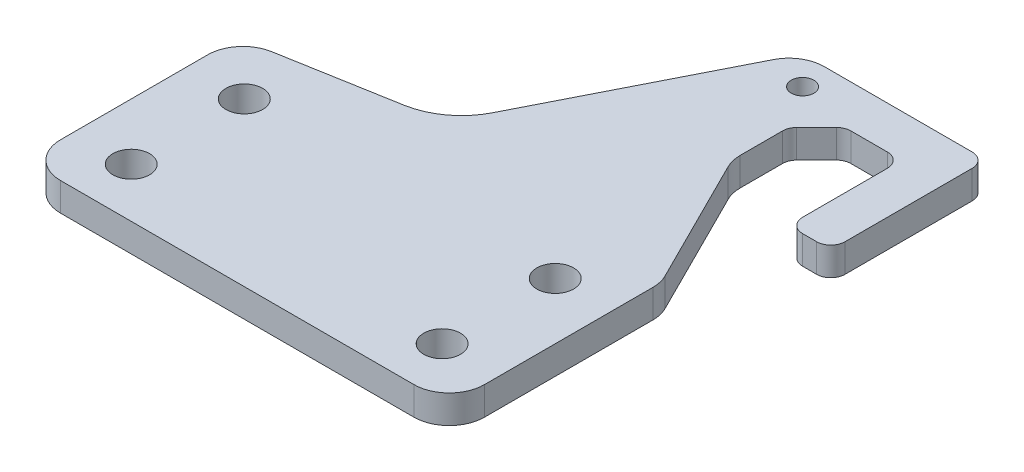
ISO-10303-21;
HEADER;
FILE_DESCRIPTION(('STEP AP214'),'2;1');
FILE_NAME('part.step','',(''),(''),'','','');
FILE_SCHEMA(('AUTOMOTIVE_DESIGN { 1 0 10303 214 1 1 1 1 }'));
ENDSEC;
DATA;
#1=APPLICATION_CONTEXT('core data for automotive mechanical design processes');
#2=APPLICATION_PROTOCOL_DEFINITION('international standard','automotive_design',2000,#1);
#3=PRODUCT_CONTEXT('',#1,'mechanical');
#4=PRODUCT('Part','Part','',(#3));
#5=PRODUCT_RELATED_PRODUCT_CATEGORY('part','',(#4));
#6=PRODUCT_DEFINITION_FORMATION('','',#4);
#7=PRODUCT_DEFINITION_CONTEXT('part definition',#1,'design');
#8=PRODUCT_DEFINITION('design','',#6,#7);
#9=PRODUCT_DEFINITION_SHAPE('','',#8);
#10=(LENGTH_UNIT() NAMED_UNIT(*) SI_UNIT(.MILLI.,.METRE.));
#11=(NAMED_UNIT(*) PLANE_ANGLE_UNIT() SI_UNIT($,.RADIAN.));
#12=(NAMED_UNIT(*) SI_UNIT($,.STERADIAN.) SOLID_ANGLE_UNIT());
#13=UNCERTAINTY_MEASURE_WITH_UNIT(LENGTH_MEASURE(1.E-05),#10,'distance_accuracy_value','');
#14=(GEOMETRIC_REPRESENTATION_CONTEXT(3) GLOBAL_UNCERTAINTY_ASSIGNED_CONTEXT((#13)) GLOBAL_UNIT_ASSIGNED_CONTEXT((#10,
#11,#12)) REPRESENTATION_CONTEXT('',''));
#15=CARTESIAN_POINT('',(0.,0.,0.));
#16=DIRECTION('',(0.,0.,1.));
#17=DIRECTION('',(1.,0.,0.));
#18=AXIS2_PLACEMENT_3D('',#15,#16,#17);
#19=CARTESIAN_POINT('',(30.,4.,-15.));
#20=DIRECTION('',(-0.894427190999916,0.,0.447213595499958));
#21=DIRECTION('',(0.447213595499958,0.,0.894427190999916));
#22=AXIS2_PLACEMENT_3D('',#19,#20,#21);
#23=PLANE('',#22);
#24=DIRECTION('',(-0.447213595499958,0.,-0.894427190999916));
#25=VECTOR('',#24,1.);
#26=CARTESIAN_POINT('',(30.,0.,-15.));
#27=LINE('',#26,#25);
#28=CARTESIAN_POINT('',(29.4721359549996,0.,-16.0557280900008));
#29=VERTEX_POINT('',#28);
#30=CARTESIAN_POINT('',(20.5278640450004,0.,-33.9442719099992));
#31=VERTEX_POINT('',#30);
#32=EDGE_CURVE('E428',#29,#31,#27,.T.);
#33=ORIENTED_EDGE('',*,*,#32,.T.);
#34=DIRECTION('',(0.,-1.,0.));
#35=VECTOR('',#34,1.);
#36=CARTESIAN_POINT('',(20.5278640450004,4.,-33.9442719099992));
#37=LINE('',#36,#35);
#38=CARTESIAN_POINT('',(20.5278640450004,4.,-33.9442719099992));
#39=VERTEX_POINT('',#38);
#40=EDGE_CURVE('E289',#31,#39,#37,.F.);
#41=ORIENTED_EDGE('',*,*,#40,.T.);
#42=DIRECTION('',(-0.447213595499958,0.,-0.894427190999916));
#43=VECTOR('',#42,1.);
#44=CARTESIAN_POINT('',(30.,4.,-15.));
#45=LINE('',#44,#43);
#46=CARTESIAN_POINT('',(29.4721359549996,4.,-16.0557280900008));
#47=VERTEX_POINT('',#46);
#48=EDGE_CURVE('E253',#47,#39,#45,.T.);
#49=ORIENTED_EDGE('',*,*,#48,.F.);
#50=DIRECTION('',(0.,-1.,0.));
#51=VECTOR('',#50,1.);
#52=CARTESIAN_POINT('',(29.4721359549996,4.,-16.0557280900008));
#53=LINE('',#52,#51);
#54=EDGE_CURVE('E286',#47,#29,#53,.T.);
#55=ORIENTED_EDGE('',*,*,#54,.T.);
#56=EDGE_LOOP('',(#33,#41,#49,#55));
#57=FACE_BOUND('',#56,.T.);
#58=ADVANCED_FACE('F39',(#57),#23,.F.);
#59=CARTESIAN_POINT('',(20.,4.,-35.));
#60=DIRECTION('',(-1.,0.,0.));
#61=DIRECTION('',(0.,0.,1.));
#62=AXIS2_PLACEMENT_3D('',#59,#60,#61);
#63=PLANE('',#62);
#64=DIRECTION('',(0.,0.,-1.));
#65=VECTOR('',#64,1.);
#66=CARTESIAN_POINT('',(20.,0.,-35.));
#67=LINE('',#66,#65);
#68=CARTESIAN_POINT('',(20.,0.,-36.180339887499));
#69=VERTEX_POINT('',#68);
#70=CARTESIAN_POINT('',(20.,0.,-42.1715728752538));
#71=VERTEX_POINT('',#70);
#72=EDGE_CURVE('E454',#69,#71,#67,.T.);
#73=ORIENTED_EDGE('',*,*,#72,.T.);
#74=DIRECTION('',(0.,-1.,0.));
#75=VECTOR('',#74,1.);
#76=CARTESIAN_POINT('',(20.,4.,-42.1715728752538));
#77=LINE('',#76,#75);
#78=CARTESIAN_POINT('',(20.,4.,-42.1715728752538));
#79=VERTEX_POINT('',#78);
#80=EDGE_CURVE('E317',#71,#79,#77,.F.);
#81=ORIENTED_EDGE('',*,*,#80,.T.);
#82=DIRECTION('',(0.,0.,-1.));
#83=VECTOR('',#82,1.);
#84=CARTESIAN_POINT('',(20.,4.,-35.));
#85=LINE('',#84,#83);
#86=CARTESIAN_POINT('',(20.,4.,-36.180339887499));
#87=VERTEX_POINT('',#86);
#88=EDGE_CURVE('E433',#87,#79,#85,.T.);
#89=ORIENTED_EDGE('',*,*,#88,.F.);
#90=DIRECTION('',(0.,-1.,0.));
#91=VECTOR('',#90,1.);
#92=CARTESIAN_POINT('',(20.,0.,-36.180339887499));
#93=LINE('',#92,#91);
#94=EDGE_CURVE('E283',#87,#69,#93,.T.);
#95=ORIENTED_EDGE('',*,*,#94,.T.);
#96=EDGE_LOOP('',(#73,#81,#89,#95));
#97=FACE_BOUND('',#96,.T.);
#98=ADVANCED_FACE('F512',(#97),#63,.F.);
#99=CARTESIAN_POINT('',(20.,4.,-43.));
#100=DIRECTION('',(-0.707106781186546,0.,-0.707106781186549));
#101=DIRECTION('',(-0.707106781186549,0.,0.707106781186546));
#102=AXIS2_PLACEMENT_3D('',#99,#100,#101);
#103=PLANE('',#102);
#104=DIRECTION('',(0.707106781186549,0.,-0.707106781186546));
#105=VECTOR('',#104,1.);
#106=CARTESIAN_POINT('',(20.,4.,-43.));
#107=LINE('',#106,#105);
#108=CARTESIAN_POINT('',(20.5857864376269,4.,-43.5857864376269));
#109=VERTEX_POINT('',#108);
#110=CARTESIAN_POINT('',(23.4142135623731,4.,-46.4142135623731));
#111=VERTEX_POINT('',#110);
#112=EDGE_CURVE('E436',#109,#111,#107,.T.);
#113=ORIENTED_EDGE('',*,*,#112,.F.);
#114=DIRECTION('',(0.,-1.,0.));
#115=VECTOR('',#114,1.);
#116=CARTESIAN_POINT('',(20.5857864376269,0.,-43.5857864376269));
#117=LINE('',#116,#115);
#118=CARTESIAN_POINT('',(20.5857864376269,0.,-43.5857864376269));
#119=VERTEX_POINT('',#118);
#120=EDGE_CURVE('E314',#109,#119,#117,.T.);
#121=ORIENTED_EDGE('',*,*,#120,.T.);
#122=DIRECTION('',(0.707106781186549,0.,-0.707106781186546));
#123=VECTOR('',#122,1.);
#124=CARTESIAN_POINT('',(20.,0.,-43.));
#125=LINE('',#124,#123);
#126=CARTESIAN_POINT('',(23.4142135623731,0.,-46.4142135623731));
#127=VERTEX_POINT('',#126);
#128=EDGE_CURVE('E457',#119,#127,#125,.T.);
#129=ORIENTED_EDGE('',*,*,#128,.T.);
#130=DIRECTION('',(0.,-1.,0.));
#131=VECTOR('',#130,1.);
#132=CARTESIAN_POINT('',(23.4142135623731,4.,-46.4142135623731));
#133=LINE('',#132,#131);
#134=EDGE_CURVE('E312',#127,#111,#133,.F.);
#135=ORIENTED_EDGE('',*,*,#134,.T.);
#136=EDGE_LOOP('',(#113,#121,#129,#135));
#137=FACE_BOUND('',#136,.T.);
#138=ADVANCED_FACE('F521',(#137),#103,.F.);
#139=CARTESIAN_POINT('',(24.,4.,-53.));
#140=DIRECTION('',(0.,0.,1.));
#141=DIRECTION('',(1.,0.,0.));
#142=AXIS2_PLACEMENT_3D('',#139,#140,#141);
#143=PLANE('',#142);
#144=DIRECTION('',(-1.,0.,0.));
#145=VECTOR('',#144,1.);
#146=CARTESIAN_POINT('',(24.,4.,-53.));
#147=LINE('',#146,#145);
#148=CARTESIAN_POINT('',(36.,4.,-53.));
#149=VERTEX_POINT('',#148);
#150=CARTESIAN_POINT('',(15.0734435338877,4.,-53.));
#151=VERTEX_POINT('',#150);
#152=EDGE_CURVE('E439',#149,#151,#147,.T.);
#153=ORIENTED_EDGE('',*,*,#152,.F.);
#154=DIRECTION('',(0.,1.,0.));
#155=VECTOR('',#154,1.);
#156=CARTESIAN_POINT('',(36.,0.,-53.));
#157=LINE('',#156,#155);
#158=CARTESIAN_POINT('',(36.,0.,-53.));
#159=VERTEX_POINT('',#158);
#160=EDGE_CURVE('E350',#149,#159,#157,.F.);
#161=ORIENTED_EDGE('',*,*,#160,.T.);
#162=DIRECTION('',(-1.,0.,0.));
#163=VECTOR('',#162,1.);
#164=CARTESIAN_POINT('',(24.,0.,-53.));
#165=LINE('',#164,#163);
#166=CARTESIAN_POINT('',(15.0734435338877,0.,-53.));
#167=VERTEX_POINT('',#166);
#168=EDGE_CURVE('E245',#159,#167,#165,.T.);
#169=ORIENTED_EDGE('',*,*,#168,.T.);
#170=DIRECTION('',(0.,-1.,0.));
#171=VECTOR('',#170,1.);
#172=CARTESIAN_POINT('',(15.0734435338877,4.,-53.));
#173=LINE('',#172,#171);
#174=EDGE_CURVE('E270',#167,#151,#173,.F.);
#175=ORIENTED_EDGE('',*,*,#174,.T.);
#176=EDGE_LOOP('',(#153,#161,#169,#175));
#177=FACE_BOUND('',#176,.T.);
#178=ADVANCED_FACE('F461',(#177),#143,.F.);
#179=CARTESIAN_POINT('',(12.,4.,-53.));
#180=DIRECTION('',(0.89224833437936,0.,0.451545025215934));
#181=DIRECTION('',(0.451545025215934,0.,-0.89224833437936));
#182=AXIS2_PLACEMENT_3D('',#179,#180,#181);
#183=PLANE('',#182);
#184=DIRECTION('',(-0.451545025215934,0.,0.89224833437936));
#185=VECTOR('',#184,1.);
#186=CARTESIAN_POINT('',(12.,4.,-53.));
#187=LINE('',#186,#185);
#188=CARTESIAN_POINT('',(10.6122018619909,4.,-50.2577251260797));
#189=VERTEX_POINT('',#188);
#190=CARTESIAN_POINT('',(-2.74094267925489,4.,-23.8720485925915));
#191=VERTEX_POINT('',#190);
#192=EDGE_CURVE('E441',#189,#191,#187,.T.);
#193=ORIENTED_EDGE('',*,*,#192,.F.);
#194=DIRECTION('',(0.,-1.,0.));
#195=VECTOR('',#194,1.);
#196=CARTESIAN_POINT('',(10.6122018619909,4.,-50.2577251260797));
#197=LINE('',#196,#195);
#198=CARTESIAN_POINT('',(10.6122018619909,0.,-50.2577251260797));
#199=VERTEX_POINT('',#198);
#200=EDGE_CURVE('E257',#189,#199,#197,.T.);
#201=ORIENTED_EDGE('',*,*,#200,.T.);
#202=DIRECTION('',(-0.451545025215934,0.,0.89224833437936));
#203=VECTOR('',#202,1.);
#204=CARTESIAN_POINT('',(12.,0.,-53.));
#205=LINE('',#204,#203);
#206=CARTESIAN_POINT('',(-2.74094267925489,0.,-23.8720485925915));
#207=VERTEX_POINT('',#206);
#208=EDGE_CURVE('E240',#199,#207,#205,.T.);
#209=ORIENTED_EDGE('',*,*,#208,.T.);
#210=DIRECTION('',(0.,-1.,0.));
#211=VECTOR('',#210,1.);
#212=CARTESIAN_POINT('',(-2.74094267925489,4.,-23.8720485925915));
#213=LINE('',#212,#211);
#214=EDGE_CURVE('E220',#207,#191,#213,.F.);
#215=ORIENTED_EDGE('',*,*,#214,.T.);
#216=EDGE_LOOP('',(#193,#201,#209,#215));
#217=FACE_BOUND('',#216,.T.);
#218=ADVANCED_FACE('F470',(#217),#183,.F.);
#219=CARTESIAN_POINT('',(-5.,4.,-19.4081745177117));
#220=DIRECTION('',(0.173648177666934,0.,0.984807753012207));
#221=DIRECTION('',(0.984807753012208,0.,-0.173648177666934));
#222=AXIS2_PLACEMENT_3D('',#219,#220,#221);
#223=PLANE('',#222);
#224=DIRECTION('',(-0.984807753012207,0.,0.173648177666934));
#225=VECTOR('',#224,1.);
#226=CARTESIAN_POINT('',(-5.,0.,-19.4081745177117));
#227=LINE('',#226,#225);
#228=CARTESIAN_POINT('',(-9.92694424637915,0.,-18.5394213146287));
#229=VERTEX_POINT('',#228);
#230=CARTESIAN_POINT('',(-25.8682408883347,0.,-15.7285406091747));
#231=VERTEX_POINT('',#230);
#232=EDGE_CURVE('E229',#229,#231,#227,.T.);
#233=ORIENTED_EDGE('',*,*,#232,.T.);
#234=DIRECTION('',(0.,-1.,0.));
#235=VECTOR('',#234,1.);
#236=CARTESIAN_POINT('',(-25.8682408883347,4.,-15.7285406091747));
#237=LINE('',#236,#235);
#238=CARTESIAN_POINT('',(-25.8682408883347,4.,-15.7285406091747));
#239=VERTEX_POINT('',#238);
#240=EDGE_CURVE('E306',#231,#239,#237,.F.);
#241=ORIENTED_EDGE('',*,*,#240,.T.);
#242=DIRECTION('',(-0.984807753012207,0.,0.173648177666934));
#243=VECTOR('',#242,1.);
#244=CARTESIAN_POINT('',(-5.,4.,-19.4081745177117));
#245=LINE('',#244,#243);
#246=CARTESIAN_POINT('',(-9.92694424637915,4.,-18.5394213146287));
#247=VERTEX_POINT('',#246);
#248=EDGE_CURVE('E232',#247,#239,#245,.T.);
#249=ORIENTED_EDGE('',*,*,#248,.F.);
#250=DIRECTION('',(0.,-1.,0.));
#251=VECTOR('',#250,1.);
#252=CARTESIAN_POINT('',(-9.92694424637915,0.,-18.5394213146287));
#253=LINE('',#252,#251);
#254=EDGE_CURVE('E218',#247,#229,#253,.T.);
#255=ORIENTED_EDGE('',*,*,#254,.T.);
#256=EDGE_LOOP('',(#233,#241,#249,#255));
#257=FACE_BOUND('',#256,.T.);
#258=ADVANCED_FACE('F228',(#257),#223,.F.);
#259=CARTESIAN_POINT('',(-30.,4.,15.));
#260=DIRECTION('',(1.,0.,0.));
#261=DIRECTION('',(0.,0.,-1.));
#262=AXIS2_PLACEMENT_3D('',#259,#260,#261);
#263=PLANE('',#262);
#264=DIRECTION('',(0.,0.,1.));
#265=VECTOR('',#264,1.);
#266=CARTESIAN_POINT('',(-30.,0.,15.));
#267=LINE('',#266,#265);
#268=CARTESIAN_POINT('',(-30.,0.,-10.8045018441136));
#269=VERTEX_POINT('',#268);
#270=CARTESIAN_POINT('',(-30.,0.,10.));
#271=VERTEX_POINT('',#270);
#272=EDGE_CURVE('E239',#269,#271,#267,.T.);
#273=ORIENTED_EDGE('',*,*,#272,.T.);
#274=DIRECTION('',(0.,-1.,0.));
#275=VECTOR('',#274,1.);
#276=CARTESIAN_POINT('',(-30.,4.,10.));
#277=LINE('',#276,#275);
#278=CARTESIAN_POINT('',(-30.,4.,10.));
#279=VERTEX_POINT('',#278);
#280=EDGE_CURVE('E304',#271,#279,#277,.F.);
#281=ORIENTED_EDGE('',*,*,#280,.T.);
#282=DIRECTION('',(0.,0.,1.));
#283=VECTOR('',#282,1.);
#284=CARTESIAN_POINT('',(-30.,4.,15.));
#285=LINE('',#284,#283);
#286=CARTESIAN_POINT('',(-30.,4.,-10.8045018441136));
#287=VERTEX_POINT('',#286);
#288=EDGE_CURVE('E444',#287,#279,#285,.T.);
#289=ORIENTED_EDGE('',*,*,#288,.F.);
#290=DIRECTION('',(0.,-1.,0.));
#291=VECTOR('',#290,1.);
#292=CARTESIAN_POINT('',(-30.,4.,-10.8045018441136));
#293=LINE('',#292,#291);
#294=EDGE_CURVE('E301',#287,#269,#293,.T.);
#295=ORIENTED_EDGE('',*,*,#294,.T.);
#296=EDGE_LOOP('',(#273,#281,#289,#295));
#297=FACE_BOUND('',#296,.T.);
#298=ADVANCED_FACE('F477',(#297),#263,.F.);
#299=CARTESIAN_POINT('',(-30.,4.,15.));
#300=DIRECTION('',(0.,0.,-1.));
#301=DIRECTION('',(-1.,0.,0.));
#302=AXIS2_PLACEMENT_3D('',#299,#300,#301);
#303=PLANE('',#302);
#304=DIRECTION('',(1.,0.,0.));
#305=VECTOR('',#304,1.);
#306=CARTESIAN_POINT('',(-30.,0.,15.));
#307=LINE('',#306,#305);
#308=CARTESIAN_POINT('',(-25.,0.,15.));
#309=VERTEX_POINT('',#308);
#310=CARTESIAN_POINT('',(25.,0.,15.));
#311=VERTEX_POINT('',#310);
#312=EDGE_CURVE('E243',#309,#311,#307,.T.);
#313=ORIENTED_EDGE('',*,*,#312,.T.);
#314=DIRECTION('',(0.,-1.,0.));
#315=VECTOR('',#314,1.);
#316=CARTESIAN_POINT('',(25.,4.,15.));
#317=LINE('',#316,#315);
#318=CARTESIAN_POINT('',(25.,4.,15.));
#319=VERTEX_POINT('',#318);
#320=EDGE_CURVE('E299',#311,#319,#317,.F.);
#321=ORIENTED_EDGE('',*,*,#320,.T.);
#322=DIRECTION('',(1.,0.,0.));
#323=VECTOR('',#322,1.);
#324=CARTESIAN_POINT('',(-30.,4.,15.));
#325=LINE('',#324,#323);
#326=CARTESIAN_POINT('',(-25.,4.,15.));
#327=VERTEX_POINT('',#326);
#328=EDGE_CURVE('E447',#327,#319,#325,.T.);
#329=ORIENTED_EDGE('',*,*,#328,.F.);
#330=DIRECTION('',(0.,-1.,0.));
#331=VECTOR('',#330,1.);
#332=CARTESIAN_POINT('',(-25.,4.,15.));
#333=LINE('',#332,#331);
#334=EDGE_CURVE('E296',#327,#309,#333,.T.);
#335=ORIENTED_EDGE('',*,*,#334,.T.);
#336=EDGE_LOOP('',(#313,#321,#329,#335));
#337=FACE_BOUND('',#336,.T.);
#338=ADVANCED_FACE('F486',(#337),#303,.F.);
#339=CARTESIAN_POINT('',(30.,4.,15.));
#340=DIRECTION('',(-1.,0.,0.));
#341=DIRECTION('',(0.,0.,1.));
#342=AXIS2_PLACEMENT_3D('',#339,#340,#341);
#343=PLANE('',#342);
#344=DIRECTION('',(0.,0.,-1.));
#345=VECTOR('',#344,1.);
#346=CARTESIAN_POINT('',(30.,0.,15.));
#347=LINE('',#346,#345);
#348=CARTESIAN_POINT('',(30.,0.,10.));
#349=VERTEX_POINT('',#348);
#350=CARTESIAN_POINT('',(30.,0.,-13.819660112501));
#351=VERTEX_POINT('',#350);
#352=EDGE_CURVE('E251',#349,#351,#347,.T.);
#353=ORIENTED_EDGE('',*,*,#352,.T.);
#354=DIRECTION('',(0.,-1.,0.));
#355=VECTOR('',#354,1.);
#356=CARTESIAN_POINT('',(30.,4.,-13.819660112501));
#357=LINE('',#356,#355);
#358=CARTESIAN_POINT('',(30.,4.,-13.819660112501));
#359=VERTEX_POINT('',#358);
#360=EDGE_CURVE('E294',#351,#359,#357,.F.);
#361=ORIENTED_EDGE('',*,*,#360,.T.);
#362=DIRECTION('',(0.,0.,-1.));
#363=VECTOR('',#362,1.);
#364=CARTESIAN_POINT('',(30.,4.,15.));
#365=LINE('',#364,#363);
#366=CARTESIAN_POINT('',(30.,4.,10.));
#367=VERTEX_POINT('',#366);
#368=EDGE_CURVE('E233',#367,#359,#365,.T.);
#369=ORIENTED_EDGE('',*,*,#368,.F.);
#370=DIRECTION('',(0.,-1.,0.));
#371=VECTOR('',#370,1.);
#372=CARTESIAN_POINT('',(30.,4.,10.));
#373=LINE('',#372,#371);
#374=EDGE_CURVE('E291',#367,#349,#373,.T.);
#375=ORIENTED_EDGE('',*,*,#374,.T.);
#376=EDGE_LOOP('',(#353,#361,#369,#375));
#377=FACE_BOUND('',#376,.T.);
#378=ADVANCED_FACE('F495',(#377),#343,.F.);
#379=CARTESIAN_POINT('',(0.,4.,0.));
#380=DIRECTION('',(0.,1.,0.));
#381=DIRECTION('',(0.,0.,1.));
#382=AXIS2_PLACEMENT_3D('',#379,#380,#381);
#383=PLANE('',#382);
#384=CARTESIAN_POINT('',(16.,4.,-49.));
#385=DIRECTION('',(0.,-1.,0.));
#386=DIRECTION('',(0.,0.,-1.));
#387=AXIS2_PLACEMENT_3D('',#384,#385,#386);
#388=CIRCLE('',#387,1.6);
#389=CARTESIAN_POINT('',(16.,4.,-50.6));
#390=VERTEX_POINT('',#389);
#391=EDGE_CURVE('E401',#390,#390,#388,.T.);
#392=ORIENTED_EDGE('',*,*,#391,.T.);
#393=EDGE_LOOP('',(#392));
#394=FACE_BOUND('',#393,.T.);
#395=CARTESIAN_POINT('',(-22.,4.,8.00000000000001));
#396=DIRECTION('',(0.,1.,0.));
#397=DIRECTION('',(0.,0.,-1.));
#398=AXIS2_PLACEMENT_3D('',#395,#396,#397);
#399=CIRCLE('',#398,2.6);
#400=CARTESIAN_POINT('',(-22.,4.,5.40000000000001));
#401=VERTEX_POINT('',#400);
#402=EDGE_CURVE('E404',#401,#401,#399,.T.);
#403=ORIENTED_EDGE('',*,*,#402,.F.);
#404=EDGE_LOOP('',(#403));
#405=FACE_BOUND('',#404,.T.);
#406=CARTESIAN_POINT('',(22.,4.,7.99999999999999));
#407=DIRECTION('',(0.,1.,0.));
#408=DIRECTION('',(0.,0.,1.));
#409=AXIS2_PLACEMENT_3D('',#406,#407,#408);
#410=CIRCLE('',#409,2.6);
#411=CARTESIAN_POINT('',(22.,4.,10.6));
#412=VERTEX_POINT('',#411);
#413=EDGE_CURVE('E417',#412,#412,#410,.T.);
#414=ORIENTED_EDGE('',*,*,#413,.F.);
#415=EDGE_LOOP('',(#414));
#416=FACE_BOUND('',#415,.T.);
#417=CARTESIAN_POINT('',(22.,4.,-8.));
#418=DIRECTION('',(0.,1.,0.));
#419=DIRECTION('',(0.,0.,-1.));
#420=AXIS2_PLACEMENT_3D('',#417,#418,#419);
#421=CIRCLE('',#420,2.6);
#422=CARTESIAN_POINT('',(22.,4.,-10.6));
#423=VERTEX_POINT('',#422);
#424=EDGE_CURVE('E411',#423,#423,#421,.T.);
#425=ORIENTED_EDGE('',*,*,#424,.F.);
#426=EDGE_LOOP('',(#425));
#427=FACE_BOUND('',#426,.T.);
#428=CARTESIAN_POINT('',(-22.,4.,-8.));
#429=DIRECTION('',(0.,1.,0.));
#430=DIRECTION('',(0.,0.,1.));
#431=AXIS2_PLACEMENT_3D('',#428,#429,#430);
#432=CIRCLE('',#431,2.6);
#433=CARTESIAN_POINT('',(-22.,4.,-5.4));
#434=VERTEX_POINT('',#433);
#435=EDGE_CURVE('E410',#434,#434,#432,.T.);
#436=ORIENTED_EDGE('',*,*,#435,.F.);
#437=EDGE_LOOP('',(#436));
#438=FACE_BOUND('',#437,.T.);
#439=DIRECTION('',(0.,0.,1.));
#440=VECTOR('',#439,1.);
#441=CARTESIAN_POINT('',(32.,4.,-47.));
#442=LINE('',#441,#440);
#443=CARTESIAN_POINT('',(32.,4.,-45.));
#444=VERTEX_POINT('',#443);
#445=CARTESIAN_POINT('',(32.,4.,-33.));
#446=VERTEX_POINT('',#445);
#447=EDGE_CURVE('E364',#444,#446,#442,.T.);
#448=ORIENTED_EDGE('',*,*,#447,.T.);
#449=CARTESIAN_POINT('',(34.,4.,-33.));
#450=DIRECTION('',(0.,1.,0.));
#451=DIRECTION('',(0.,0.,1.));
#452=AXIS2_PLACEMENT_3D('',#449,#450,#451);
#453=CIRCLE('',#452,2.);
#454=CARTESIAN_POINT('',(34.,4.,-31.));
#455=VERTEX_POINT('',#454);
#456=EDGE_CURVE('E334',#446,#455,#453,.T.);
#457=ORIENTED_EDGE('',*,*,#456,.T.);
#458=DIRECTION('',(1.,0.,0.));
#459=VECTOR('',#458,1.);
#460=CARTESIAN_POINT('',(32.,4.,-31.));
#461=LINE('',#460,#459);
#462=CARTESIAN_POINT('',(36.,4.,-31.));
#463=VERTEX_POINT('',#462);
#464=EDGE_CURVE('E375',#455,#463,#461,.T.);
#465=ORIENTED_EDGE('',*,*,#464,.T.);
#466=CARTESIAN_POINT('',(36.,4.,-33.));
#467=DIRECTION('',(0.,1.,0.));
#468=DIRECTION('',(0.,0.,1.));
#469=AXIS2_PLACEMENT_3D('',#466,#467,#468);
#470=CIRCLE('',#469,2.);
#471=CARTESIAN_POINT('',(38.,4.,-33.));
#472=VERTEX_POINT('',#471);
#473=EDGE_CURVE('E330',#463,#472,#470,.T.);
#474=ORIENTED_EDGE('',*,*,#473,.T.);
#475=DIRECTION('',(0.,0.,-1.));
#476=VECTOR('',#475,1.);
#477=CARTESIAN_POINT('',(38.,4.,-31.));
#478=LINE('',#477,#476);
#479=CARTESIAN_POINT('',(38.,4.,-51.));
#480=VERTEX_POINT('',#479);
#481=EDGE_CURVE('E386',#472,#480,#478,.T.);
#482=ORIENTED_EDGE('',*,*,#481,.T.);
#483=CARTESIAN_POINT('',(36.,4.,-51.));
#484=DIRECTION('',(0.,1.,0.));
#485=DIRECTION('',(0.,0.,1.));
#486=AXIS2_PLACEMENT_3D('',#483,#484,#485);
#487=CIRCLE('',#486,2.);
#488=EDGE_CURVE('E332',#480,#149,#487,.T.);
#489=ORIENTED_EDGE('',*,*,#488,.T.);
#490=ORIENTED_EDGE('',*,*,#152,.T.);
#491=CARTESIAN_POINT('',(15.0734435338877,4.,-48.));
#492=DIRECTION('',(0.,1.,0.));
#493=DIRECTION('',(0.,0.,1.));
#494=AXIS2_PLACEMENT_3D('',#491,#492,#493);
#495=CIRCLE('',#494,5.);
#496=EDGE_CURVE('E281',#151,#189,#495,.T.);
#497=ORIENTED_EDGE('',*,*,#496,.T.);
#498=ORIENTED_EDGE('',*,*,#192,.T.);
#499=CARTESIAN_POINT('',(-11.6634260230485,4.,-28.3874988447508));
#500=DIRECTION('',(0.,1.,0.));
#501=DIRECTION('',(0.,0.,1.));
#502=AXIS2_PLACEMENT_3D('',#499,#500,#501);
#503=CIRCLE('',#502,10.);
#504=EDGE_CURVE('E223',#191,#247,#503,.F.);
#505=ORIENTED_EDGE('',*,*,#504,.T.);
#506=ORIENTED_EDGE('',*,*,#248,.T.);
#507=CARTESIAN_POINT('',(-25.,4.,-10.8045018441136));
#508=DIRECTION('',(0.,1.,0.));
#509=DIRECTION('',(0.,0.,1.));
#510=AXIS2_PLACEMENT_3D('',#507,#508,#509);
#511=CIRCLE('',#510,5.);
#512=EDGE_CURVE('E273',#239,#287,#511,.T.);
#513=ORIENTED_EDGE('',*,*,#512,.T.);
#514=ORIENTED_EDGE('',*,*,#288,.T.);
#515=CARTESIAN_POINT('',(-25.,4.,10.));
#516=DIRECTION('',(0.,1.,0.));
#517=DIRECTION('',(0.,0.,1.));
#518=AXIS2_PLACEMENT_3D('',#515,#516,#517);
#519=CIRCLE('',#518,5.);
#520=EDGE_CURVE('E275',#279,#327,#519,.T.);
#521=ORIENTED_EDGE('',*,*,#520,.T.);
#522=ORIENTED_EDGE('',*,*,#328,.T.);
#523=CARTESIAN_POINT('',(25.,4.,10.));
#524=DIRECTION('',(0.,1.,0.));
#525=DIRECTION('',(0.,0.,1.));
#526=AXIS2_PLACEMENT_3D('',#523,#524,#525);
#527=CIRCLE('',#526,5.);
#528=EDGE_CURVE('E277',#319,#367,#527,.T.);
#529=ORIENTED_EDGE('',*,*,#528,.T.);
#530=ORIENTED_EDGE('',*,*,#368,.T.);
#531=CARTESIAN_POINT('',(25.,4.,-13.819660112501));
#532=DIRECTION('',(0.,1.,0.));
#533=DIRECTION('',(0.,0.,1.));
#534=AXIS2_PLACEMENT_3D('',#531,#532,#533);
#535=CIRCLE('',#534,5.);
#536=EDGE_CURVE('E279',#359,#47,#535,.T.);
#537=ORIENTED_EDGE('',*,*,#536,.T.);
#538=ORIENTED_EDGE('',*,*,#48,.T.);
#539=CARTESIAN_POINT('',(25.,4.,-36.180339887499));
#540=DIRECTION('',(0.,1.,0.));
#541=DIRECTION('',(0.,0.,1.));
#542=AXIS2_PLACEMENT_3D('',#539,#540,#541);
#543=CIRCLE('',#542,5.);
#544=EDGE_CURVE('E310',#39,#87,#543,.F.);
#545=ORIENTED_EDGE('',*,*,#544,.T.);
#546=ORIENTED_EDGE('',*,*,#88,.T.);
#547=CARTESIAN_POINT('',(22.,4.,-42.1715728752538));
#548=DIRECTION('',(0.,1.,0.));
#549=DIRECTION('',(0.,0.,1.));
#550=AXIS2_PLACEMENT_3D('',#547,#548,#549);
#551=CIRCLE('',#550,2.);
#552=EDGE_CURVE('E354',#79,#109,#551,.F.);
#553=ORIENTED_EDGE('',*,*,#552,.T.);
#554=ORIENTED_EDGE('',*,*,#112,.T.);
#555=CARTESIAN_POINT('',(24.8284271247462,4.,-45.));
#556=DIRECTION('',(0.,1.,0.));
#557=DIRECTION('',(0.,0.,1.));
#558=AXIS2_PLACEMENT_3D('',#555,#556,#557);
#559=CIRCLE('',#558,2.);
#560=CARTESIAN_POINT('',(24.8284271247462,4.,-47.));
#561=VERTEX_POINT('',#560);
#562=EDGE_CURVE('E358',#111,#561,#559,.F.);
#563=ORIENTED_EDGE('',*,*,#562,.T.);
#564=DIRECTION('',(1.,0.,0.));
#565=VECTOR('',#564,1.);
#566=CARTESIAN_POINT('',(24.,4.,-47.));
#567=LINE('',#566,#565);
#568=CARTESIAN_POINT('',(30.,4.,-47.));
#569=VERTEX_POINT('',#568);
#570=EDGE_CURVE('E366',#561,#569,#567,.T.);
#571=ORIENTED_EDGE('',*,*,#570,.T.);
#572=CARTESIAN_POINT('',(30.,4.,-45.));
#573=DIRECTION('',(0.,1.,0.));
#574=DIRECTION('',(0.,0.,1.));
#575=AXIS2_PLACEMENT_3D('',#572,#573,#574);
#576=CIRCLE('',#575,2.);
#577=EDGE_CURVE('E47',#569,#444,#576,.F.);
#578=ORIENTED_EDGE('',*,*,#577,.T.);
#579=EDGE_LOOP('',(#448,#457,#465,#474,#482,#489,#490,#497,#498,#505,#506,#513,#514,#521,#522,
#529,#530,#537,#538,#545,#546,#553,#554,#563,#571,#578));
#580=FACE_BOUND('',#579,.T.);
#581=ADVANCED_FACE('F363',(#394,#405,#416,#427,#438,#580),#383,.T.);
#582=CARTESIAN_POINT('',(0.,0.,0.));
#583=DIRECTION('',(0.,1.,0.));
#584=DIRECTION('',(0.,0.,1.));
#585=AXIS2_PLACEMENT_3D('',#582,#583,#584);
#586=PLANE('',#585);
#587=CARTESIAN_POINT('',(16.,0.,-49.));
#588=DIRECTION('',(0.,-1.,0.));
#589=DIRECTION('',(0.,0.,-1.));
#590=AXIS2_PLACEMENT_3D('',#587,#588,#589);
#591=CIRCLE('',#590,1.6);
#592=CARTESIAN_POINT('',(16.,0.,-50.6));
#593=VERTEX_POINT('',#592);
#594=EDGE_CURVE('E397',#593,#593,#591,.T.);
#595=ORIENTED_EDGE('',*,*,#594,.F.);
#596=EDGE_LOOP('',(#595));
#597=FACE_BOUND('',#596,.T.);
#598=CARTESIAN_POINT('',(-22.,0.,8.00000000000001));
#599=DIRECTION('',(0.,1.,0.));
#600=DIRECTION('',(0.,0.,-1.));
#601=AXIS2_PLACEMENT_3D('',#598,#599,#600);
#602=CIRCLE('',#601,2.6);
#603=CARTESIAN_POINT('',(-22.,0.,5.40000000000001));
#604=VERTEX_POINT('',#603);
#605=EDGE_CURVE('E420',#604,#604,#602,.T.);
#606=ORIENTED_EDGE('',*,*,#605,.T.);
#607=EDGE_LOOP('',(#606));
#608=FACE_BOUND('',#607,.T.);
#609=CARTESIAN_POINT('',(22.,0.,7.99999999999999));
#610=DIRECTION('',(0.,1.,0.));
#611=DIRECTION('',(0.,0.,1.));
#612=AXIS2_PLACEMENT_3D('',#609,#610,#611);
#613=CIRCLE('',#612,2.6);
#614=CARTESIAN_POINT('',(22.,0.,10.6));
#615=VERTEX_POINT('',#614);
#616=EDGE_CURVE('E414',#615,#615,#613,.T.);
#617=ORIENTED_EDGE('',*,*,#616,.T.);
#618=EDGE_LOOP('',(#617));
#619=FACE_BOUND('',#618,.T.);
#620=CARTESIAN_POINT('',(22.,0.,-8.));
#621=DIRECTION('',(0.,1.,0.));
#622=DIRECTION('',(0.,0.,-1.));
#623=AXIS2_PLACEMENT_3D('',#620,#621,#622);
#624=CIRCLE('',#623,2.6);
#625=CARTESIAN_POINT('',(22.,0.,-10.6));
#626=VERTEX_POINT('',#625);
#627=EDGE_CURVE('E407',#626,#626,#624,.T.);
#628=ORIENTED_EDGE('',*,*,#627,.T.);
#629=EDGE_LOOP('',(#628));
#630=FACE_BOUND('',#629,.T.);
#631=CARTESIAN_POINT('',(-22.,0.,-8.));
#632=DIRECTION('',(0.,1.,0.));
#633=DIRECTION('',(0.,0.,1.));
#634=AXIS2_PLACEMENT_3D('',#631,#632,#633);
#635=CIRCLE('',#634,2.6);
#636=CARTESIAN_POINT('',(-22.,0.,-5.4));
#637=VERTEX_POINT('',#636);
#638=EDGE_CURVE('E425',#637,#637,#635,.T.);
#639=ORIENTED_EDGE('',*,*,#638,.T.);
#640=EDGE_LOOP('',(#639));
#641=FACE_BOUND('',#640,.T.);
#642=DIRECTION('',(1.,0.,0.));
#643=VECTOR('',#642,1.);
#644=CARTESIAN_POINT('',(32.,0.,-31.));
#645=LINE('',#644,#643);
#646=CARTESIAN_POINT('',(34.,0.,-31.));
#647=VERTEX_POINT('',#646);
#648=CARTESIAN_POINT('',(36.,0.,-31.));
#649=VERTEX_POINT('',#648);
#650=EDGE_CURVE('E388',#647,#649,#645,.T.);
#651=ORIENTED_EDGE('',*,*,#650,.F.);
#652=CARTESIAN_POINT('',(34.,0.,-33.));
#653=DIRECTION('',(0.,1.,0.));
#654=DIRECTION('',(0.,0.,1.));
#655=AXIS2_PLACEMENT_3D('',#652,#653,#654);
#656=CIRCLE('',#655,2.);
#657=CARTESIAN_POINT('',(32.,0.,-33.));
#658=VERTEX_POINT('',#657);
#659=EDGE_CURVE('E344',#647,#658,#656,.F.);
#660=ORIENTED_EDGE('',*,*,#659,.T.);
#661=DIRECTION('',(0.,0.,1.));
#662=VECTOR('',#661,1.);
#663=CARTESIAN_POINT('',(32.,0.,-47.));
#664=LINE('',#663,#662);
#665=CARTESIAN_POINT('',(32.,0.,-45.));
#666=VERTEX_POINT('',#665);
#667=EDGE_CURVE('E382',#666,#658,#664,.T.);
#668=ORIENTED_EDGE('',*,*,#667,.F.);
#669=CARTESIAN_POINT('',(30.,0.,-45.));
#670=DIRECTION('',(0.,1.,0.));
#671=DIRECTION('',(0.,0.,1.));
#672=AXIS2_PLACEMENT_3D('',#669,#670,#671);
#673=CIRCLE('',#672,2.);
#674=CARTESIAN_POINT('',(30.,0.,-47.));
#675=VERTEX_POINT('',#674);
#676=EDGE_CURVE('E11',#666,#675,#673,.T.);
#677=ORIENTED_EDGE('',*,*,#676,.T.);
#678=DIRECTION('',(1.,0.,0.));
#679=VECTOR('',#678,1.);
#680=CARTESIAN_POINT('',(24.,0.,-47.));
#681=LINE('',#680,#679);
#682=CARTESIAN_POINT('',(24.8284271247462,0.,-47.));
#683=VERTEX_POINT('',#682);
#684=EDGE_CURVE('E381',#683,#675,#681,.T.);
#685=ORIENTED_EDGE('',*,*,#684,.F.);
#686=CARTESIAN_POINT('',(24.8284271247462,0.,-45.));
#687=DIRECTION('',(0.,1.,0.));
#688=DIRECTION('',(0.,0.,1.));
#689=AXIS2_PLACEMENT_3D('',#686,#687,#688);
#690=CIRCLE('',#689,2.);
#691=EDGE_CURVE('E356',#683,#127,#690,.T.);
#692=ORIENTED_EDGE('',*,*,#691,.T.);
#693=ORIENTED_EDGE('',*,*,#128,.F.);
#694=CARTESIAN_POINT('',(22.,0.,-42.1715728752538));
#695=DIRECTION('',(0.,1.,0.));
#696=DIRECTION('',(0.,0.,1.));
#697=AXIS2_PLACEMENT_3D('',#694,#695,#696);
#698=CIRCLE('',#697,2.);
#699=EDGE_CURVE('E352',#119,#71,#698,.T.);
#700=ORIENTED_EDGE('',*,*,#699,.T.);
#701=ORIENTED_EDGE('',*,*,#72,.F.);
#702=CARTESIAN_POINT('',(25.,0.,-36.180339887499));
#703=DIRECTION('',(0.,1.,0.));
#704=DIRECTION('',(0.,0.,1.));
#705=AXIS2_PLACEMENT_3D('',#702,#703,#704);
#706=CIRCLE('',#705,5.);
#707=EDGE_CURVE('E308',#69,#31,#706,.T.);
#708=ORIENTED_EDGE('',*,*,#707,.T.);
#709=ORIENTED_EDGE('',*,*,#32,.F.);
#710=CARTESIAN_POINT('',(25.,0.,-13.819660112501));
#711=DIRECTION('',(0.,1.,0.));
#712=DIRECTION('',(0.,0.,1.));
#713=AXIS2_PLACEMENT_3D('',#710,#711,#712);
#714=CIRCLE('',#713,5.);
#715=EDGE_CURVE('E265',#29,#351,#714,.F.);
#716=ORIENTED_EDGE('',*,*,#715,.T.);
#717=ORIENTED_EDGE('',*,*,#352,.F.);
#718=CARTESIAN_POINT('',(25.,0.,10.));
#719=DIRECTION('',(0.,1.,0.));
#720=DIRECTION('',(0.,0.,1.));
#721=AXIS2_PLACEMENT_3D('',#718,#719,#720);
#722=CIRCLE('',#721,5.);
#723=EDGE_CURVE('E263',#349,#311,#722,.F.);
#724=ORIENTED_EDGE('',*,*,#723,.T.);
#725=ORIENTED_EDGE('',*,*,#312,.F.);
#726=CARTESIAN_POINT('',(-25.,0.,10.));
#727=DIRECTION('',(0.,1.,0.));
#728=DIRECTION('',(0.,0.,1.));
#729=AXIS2_PLACEMENT_3D('',#726,#727,#728);
#730=CIRCLE('',#729,5.);
#731=EDGE_CURVE('E261',#309,#271,#730,.F.);
#732=ORIENTED_EDGE('',*,*,#731,.T.);
#733=ORIENTED_EDGE('',*,*,#272,.F.);
#734=CARTESIAN_POINT('',(-25.,0.,-10.8045018441136));
#735=DIRECTION('',(0.,1.,0.));
#736=DIRECTION('',(0.,0.,1.));
#737=AXIS2_PLACEMENT_3D('',#734,#735,#736);
#738=CIRCLE('',#737,5.);
#739=EDGE_CURVE('E238',#269,#231,#738,.F.);
#740=ORIENTED_EDGE('',*,*,#739,.T.);
#741=ORIENTED_EDGE('',*,*,#232,.F.);
#742=CARTESIAN_POINT('',(-11.6634260230485,0.,-28.3874988447508));
#743=DIRECTION('',(0.,1.,0.));
#744=DIRECTION('',(0.,0.,1.));
#745=AXIS2_PLACEMENT_3D('',#742,#743,#744);
#746=CIRCLE('',#745,10.);
#747=EDGE_CURVE('E214',#229,#207,#746,.T.);
#748=ORIENTED_EDGE('',*,*,#747,.T.);
#749=ORIENTED_EDGE('',*,*,#208,.F.);
#750=CARTESIAN_POINT('',(15.0734435338877,0.,-48.));
#751=DIRECTION('',(0.,1.,0.));
#752=DIRECTION('',(0.,0.,1.));
#753=AXIS2_PLACEMENT_3D('',#750,#751,#752);
#754=CIRCLE('',#753,5.);
#755=EDGE_CURVE('E267',#199,#167,#754,.F.);
#756=ORIENTED_EDGE('',*,*,#755,.T.);
#757=ORIENTED_EDGE('',*,*,#168,.F.);
#758=CARTESIAN_POINT('',(36.,0.,-51.));
#759=DIRECTION('',(0.,1.,0.));
#760=DIRECTION('',(0.,0.,1.));
#761=AXIS2_PLACEMENT_3D('',#758,#759,#760);
#762=CIRCLE('',#761,2.);
#763=CARTESIAN_POINT('',(38.,0.,-51.));
#764=VERTEX_POINT('',#763);
#765=EDGE_CURVE('E54',#159,#764,#762,.F.);
#766=ORIENTED_EDGE('',*,*,#765,.T.);
#767=DIRECTION('',(0.,0.,-1.));
#768=VECTOR('',#767,1.);
#769=CARTESIAN_POINT('',(38.,0.,-31.));
#770=LINE('',#769,#768);
#771=CARTESIAN_POINT('',(38.,0.,-33.));
#772=VERTEX_POINT('',#771);
#773=EDGE_CURVE('E395',#772,#764,#770,.T.);
#774=ORIENTED_EDGE('',*,*,#773,.F.);
#775=CARTESIAN_POINT('',(36.,0.,-33.));
#776=DIRECTION('',(0.,1.,0.));
#777=DIRECTION('',(0.,0.,1.));
#778=AXIS2_PLACEMENT_3D('',#775,#776,#777);
#779=CIRCLE('',#778,2.);
#780=EDGE_CURVE('E341',#772,#649,#779,.F.);
#781=ORIENTED_EDGE('',*,*,#780,.T.);
#782=EDGE_LOOP('',(#651,#660,#668,#677,#685,#692,#693,#700,#701,#708,#709,#716,#717,#724,#725,
#732,#733,#740,#741,#748,#749,#756,#757,#766,#774,#781));
#783=FACE_BOUND('',#782,.T.);
#784=ADVANCED_FACE('F236',(#597,#608,#619,#630,#641,#783),#586,.F.);
#785=CARTESIAN_POINT('',(-11.6634260230485,4.,-28.3874988447508));
#786=DIRECTION('',(0.,1.,0.));
#787=DIRECTION('',(0.,0.,1.));
#788=AXIS2_PLACEMENT_3D('',#785,#786,#787);
#789=CYLINDRICAL_SURFACE('',#788,10.);
#790=ORIENTED_EDGE('',*,*,#504,.F.);
#791=ORIENTED_EDGE('',*,*,#214,.F.);
#792=ORIENTED_EDGE('',*,*,#747,.F.);
#793=ORIENTED_EDGE('',*,*,#254,.F.);
#794=EDGE_LOOP('',(#790,#791,#792,#793));
#795=FACE_BOUND('',#794,.T.);
#796=ADVANCED_FACE('F217',(#795),#789,.F.);
#797=CARTESIAN_POINT('',(15.0734435338877,4.,-48.));
#798=DIRECTION('',(0.,-1.,0.));
#799=DIRECTION('',(0.,0.,-1.));
#800=AXIS2_PLACEMENT_3D('',#797,#798,#799);
#801=CYLINDRICAL_SURFACE('',#800,5.);
#802=ORIENTED_EDGE('',*,*,#496,.F.);
#803=ORIENTED_EDGE('',*,*,#174,.F.);
#804=ORIENTED_EDGE('',*,*,#755,.F.);
#805=ORIENTED_EDGE('',*,*,#200,.F.);
#806=EDGE_LOOP('',(#802,#803,#804,#805));
#807=FACE_BOUND('',#806,.T.);
#808=ADVANCED_FACE('F467',(#807),#801,.T.);
#809=CARTESIAN_POINT('',(25.,4.,-36.180339887499));
#810=DIRECTION('',(0.,1.,0.));
#811=DIRECTION('',(0.,0.,1.));
#812=AXIS2_PLACEMENT_3D('',#809,#810,#811);
#813=CYLINDRICAL_SURFACE('',#812,5.);
#814=ORIENTED_EDGE('',*,*,#544,.F.);
#815=ORIENTED_EDGE('',*,*,#40,.F.);
#816=ORIENTED_EDGE('',*,*,#707,.F.);
#817=ORIENTED_EDGE('',*,*,#94,.F.);
#818=EDGE_LOOP('',(#814,#815,#816,#817));
#819=FACE_BOUND('',#818,.T.);
#820=ADVANCED_FACE('F509',(#819),#813,.F.);
#821=CARTESIAN_POINT('',(25.,4.,-13.819660112501));
#822=DIRECTION('',(0.,-1.,0.));
#823=DIRECTION('',(0.,0.,-1.));
#824=AXIS2_PLACEMENT_3D('',#821,#822,#823);
#825=CYLINDRICAL_SURFACE('',#824,5.);
#826=ORIENTED_EDGE('',*,*,#536,.F.);
#827=ORIENTED_EDGE('',*,*,#360,.F.);
#828=ORIENTED_EDGE('',*,*,#715,.F.);
#829=ORIENTED_EDGE('',*,*,#54,.F.);
#830=EDGE_LOOP('',(#826,#827,#828,#829));
#831=FACE_BOUND('',#830,.T.);
#832=ADVANCED_FACE('F501',(#831),#825,.T.);
#833=CARTESIAN_POINT('',(25.,4.,10.));
#834=DIRECTION('',(0.,-1.,0.));
#835=DIRECTION('',(0.,0.,-1.));
#836=AXIS2_PLACEMENT_3D('',#833,#834,#835);
#837=CYLINDRICAL_SURFACE('',#836,5.);
#838=ORIENTED_EDGE('',*,*,#528,.F.);
#839=ORIENTED_EDGE('',*,*,#320,.F.);
#840=ORIENTED_EDGE('',*,*,#723,.F.);
#841=ORIENTED_EDGE('',*,*,#374,.F.);
#842=EDGE_LOOP('',(#838,#839,#840,#841));
#843=FACE_BOUND('',#842,.T.);
#844=ADVANCED_FACE('F492',(#843),#837,.T.);
#845=CARTESIAN_POINT('',(-25.,4.,10.));
#846=DIRECTION('',(0.,-1.,0.));
#847=DIRECTION('',(0.,0.,-1.));
#848=AXIS2_PLACEMENT_3D('',#845,#846,#847);
#849=CYLINDRICAL_SURFACE('',#848,5.);
#850=ORIENTED_EDGE('',*,*,#520,.F.);
#851=ORIENTED_EDGE('',*,*,#280,.F.);
#852=ORIENTED_EDGE('',*,*,#731,.F.);
#853=ORIENTED_EDGE('',*,*,#334,.F.);
#854=EDGE_LOOP('',(#850,#851,#852,#853));
#855=FACE_BOUND('',#854,.T.);
#856=ADVANCED_FACE('F483',(#855),#849,.T.);
#857=CARTESIAN_POINT('',(-25.,4.,-10.8045018441136));
#858=DIRECTION('',(0.,-1.,0.));
#859=DIRECTION('',(0.,0.,-1.));
#860=AXIS2_PLACEMENT_3D('',#857,#858,#859);
#861=CYLINDRICAL_SURFACE('',#860,5.);
#862=ORIENTED_EDGE('',*,*,#512,.F.);
#863=ORIENTED_EDGE('',*,*,#240,.F.);
#864=ORIENTED_EDGE('',*,*,#739,.F.);
#865=ORIENTED_EDGE('',*,*,#294,.F.);
#866=EDGE_LOOP('',(#862,#863,#864,#865));
#867=FACE_BOUND('',#866,.T.);
#868=ADVANCED_FACE('F475',(#867),#861,.T.);
#869=CARTESIAN_POINT('',(-22.,0.,-8.));
#870=DIRECTION('',(0.,1.,0.));
#871=DIRECTION('',(0.,0.,1.));
#872=AXIS2_PLACEMENT_3D('',#869,#870,#871);
#873=CYLINDRICAL_SURFACE('',#872,2.6);
#874=ORIENTED_EDGE('',*,*,#638,.F.);
#875=EDGE_LOOP('',(#874));
#876=FACE_BOUND('',#875,.T.);
#877=ORIENTED_EDGE('',*,*,#435,.T.);
#878=EDGE_LOOP('',(#877));
#879=FACE_BOUND('',#878,.T.);
#880=ADVANCED_FACE('F556',(#876,#879),#873,.F.);
#881=CARTESIAN_POINT('',(22.,0.,-8.));
#882=DIRECTION('',(0.,1.,0.));
#883=DIRECTION('',(0.,0.,1.));
#884=AXIS2_PLACEMENT_3D('',#881,#882,#883);
#885=CYLINDRICAL_SURFACE('',#884,2.6);
#886=ORIENTED_EDGE('',*,*,#627,.F.);
#887=EDGE_LOOP('',(#886));
#888=FACE_BOUND('',#887,.T.);
#889=ORIENTED_EDGE('',*,*,#424,.T.);
#890=EDGE_LOOP('',(#889));
#891=FACE_BOUND('',#890,.T.);
#892=ADVANCED_FACE('F560',(#888,#891),#885,.F.);
#893=CARTESIAN_POINT('',(22.,0.,7.99999999999999));
#894=DIRECTION('',(0.,1.,0.));
#895=DIRECTION('',(0.,0.,1.));
#896=AXIS2_PLACEMENT_3D('',#893,#894,#895);
#897=CYLINDRICAL_SURFACE('',#896,2.6);
#898=ORIENTED_EDGE('',*,*,#616,.F.);
#899=EDGE_LOOP('',(#898));
#900=FACE_BOUND('',#899,.T.);
#901=ORIENTED_EDGE('',*,*,#413,.T.);
#902=EDGE_LOOP('',(#901));
#903=FACE_BOUND('',#902,.T.);
#904=ADVANCED_FACE('F566',(#900,#903),#897,.F.);
#905=CARTESIAN_POINT('',(-22.,0.,8.00000000000001));
#906=DIRECTION('',(0.,1.,0.));
#907=DIRECTION('',(0.,0.,1.));
#908=AXIS2_PLACEMENT_3D('',#905,#906,#907);
#909=CYLINDRICAL_SURFACE('',#908,2.6);
#910=ORIENTED_EDGE('',*,*,#605,.F.);
#911=EDGE_LOOP('',(#910));
#912=FACE_BOUND('',#911,.T.);
#913=ORIENTED_EDGE('',*,*,#402,.T.);
#914=EDGE_LOOP('',(#913));
#915=FACE_BOUND('',#914,.T.);
#916=ADVANCED_FACE('F573',(#912,#915),#909,.F.);
#917=CARTESIAN_POINT('',(16.,4.,-49.));
#918=DIRECTION('',(0.,-1.,0.));
#919=DIRECTION('',(0.,0.,-1.));
#920=AXIS2_PLACEMENT_3D('',#917,#918,#919);
#921=CYLINDRICAL_SURFACE('',#920,1.6);
#922=ORIENTED_EDGE('',*,*,#391,.F.);
#923=EDGE_LOOP('',(#922));
#924=FACE_BOUND('',#923,.T.);
#925=ORIENTED_EDGE('',*,*,#594,.T.);
#926=EDGE_LOOP('',(#925));
#927=FACE_BOUND('',#926,.T.);
#928=ADVANCED_FACE('F690',(#924,#927),#921,.F.);
#929=CARTESIAN_POINT('',(38.,0.,-31.));
#930=DIRECTION('',(1.,0.,0.));
#931=DIRECTION('',(0.,0.,-1.));
#932=AXIS2_PLACEMENT_3D('',#929,#930,#931);
#933=PLANE('',#932);
#934=ORIENTED_EDGE('',*,*,#773,.T.);
#935=DIRECTION('',(0.,1.,0.));
#936=VECTOR('',#935,1.);
#937=CARTESIAN_POINT('',(38.,4.,-51.));
#938=LINE('',#937,#936);
#939=EDGE_CURVE('E347',#764,#480,#938,.T.);
#940=ORIENTED_EDGE('',*,*,#939,.T.);
#941=ORIENTED_EDGE('',*,*,#481,.F.);
#942=DIRECTION('',(0.,1.,0.));
#943=VECTOR('',#942,1.);
#944=CARTESIAN_POINT('',(38.,0.,-33.));
#945=LINE('',#944,#943);
#946=EDGE_CURVE('E61',#472,#772,#945,.F.);
#947=ORIENTED_EDGE('',*,*,#946,.T.);
#948=EDGE_LOOP('',(#934,#940,#941,#947));
#949=FACE_BOUND('',#948,.T.);
#950=ADVANCED_FACE('F699',(#949),#933,.T.);
#951=CARTESIAN_POINT('',(32.,0.,-31.));
#952=DIRECTION('',(0.,0.,1.));
#953=DIRECTION('',(1.,0.,0.));
#954=AXIS2_PLACEMENT_3D('',#951,#952,#953);
#955=PLANE('',#954);
#956=ORIENTED_EDGE('',*,*,#464,.F.);
#957=DIRECTION('',(0.,1.,0.));
#958=VECTOR('',#957,1.);
#959=CARTESIAN_POINT('',(34.,0.,-31.));
#960=LINE('',#959,#958);
#961=EDGE_CURVE('E339',#455,#647,#960,.F.);
#962=ORIENTED_EDGE('',*,*,#961,.T.);
#963=ORIENTED_EDGE('',*,*,#650,.T.);
#964=DIRECTION('',(0.,1.,0.));
#965=VECTOR('',#964,1.);
#966=CARTESIAN_POINT('',(36.,0.,-31.));
#967=LINE('',#966,#965);
#968=EDGE_CURVE('E336',#649,#463,#967,.T.);
#969=ORIENTED_EDGE('',*,*,#968,.T.);
#970=EDGE_LOOP('',(#956,#962,#963,#969));
#971=FACE_BOUND('',#970,.T.);
#972=ADVANCED_FACE('F793',(#971),#955,.T.);
#973=CARTESIAN_POINT('',(32.,0.,-47.));
#974=DIRECTION('',(-1.,0.,0.));
#975=DIRECTION('',(0.,0.,1.));
#976=AXIS2_PLACEMENT_3D('',#973,#974,#975);
#977=PLANE('',#976);
#978=ORIENTED_EDGE('',*,*,#447,.F.);
#979=DIRECTION('',(0.,1.,0.));
#980=VECTOR('',#979,1.);
#981=CARTESIAN_POINT('',(32.,0.,-45.));
#982=LINE('',#981,#980);
#983=EDGE_CURVE('E328',#444,#666,#982,.F.);
#984=ORIENTED_EDGE('',*,*,#983,.T.);
#985=ORIENTED_EDGE('',*,*,#667,.T.);
#986=DIRECTION('',(0.,1.,0.));
#987=VECTOR('',#986,1.);
#988=CARTESIAN_POINT('',(32.,0.,-33.));
#989=LINE('',#988,#987);
#990=EDGE_CURVE('E325',#658,#446,#989,.T.);
#991=ORIENTED_EDGE('',*,*,#990,.T.);
#992=EDGE_LOOP('',(#978,#984,#985,#991));
#993=FACE_BOUND('',#992,.T.);
#994=ADVANCED_FACE('F371',(#993),#977,.T.);
#995=CARTESIAN_POINT('',(24.,0.,-47.));
#996=DIRECTION('',(0.,0.,1.));
#997=DIRECTION('',(1.,0.,0.));
#998=AXIS2_PLACEMENT_3D('',#995,#996,#997);
#999=PLANE('',#998);
#1000=ORIENTED_EDGE('',*,*,#570,.F.);
#1001=DIRECTION('',(0.,-1.,0.));
#1002=VECTOR('',#1001,1.);
#1003=CARTESIAN_POINT('',(24.8284271247462,0.,-47.));
#1004=LINE('',#1003,#1002);
#1005=EDGE_CURVE('E322',#561,#683,#1004,.T.);
#1006=ORIENTED_EDGE('',*,*,#1005,.T.);
#1007=ORIENTED_EDGE('',*,*,#684,.T.);
#1008=DIRECTION('',(0.,1.,0.));
#1009=VECTOR('',#1008,1.);
#1010=CARTESIAN_POINT('',(30.,4.,-47.));
#1011=LINE('',#1010,#1009);
#1012=EDGE_CURVE('E319',#675,#569,#1011,.T.);
#1013=ORIENTED_EDGE('',*,*,#1012,.T.);
#1014=EDGE_LOOP('',(#1000,#1006,#1007,#1013));
#1015=FACE_BOUND('',#1014,.T.);
#1016=ADVANCED_FACE('F384',(#1015),#999,.T.);
#1017=CARTESIAN_POINT('',(22.,4.,-42.1715728752538));
#1018=DIRECTION('',(0.,1.,0.));
#1019=DIRECTION('',(0.,0.,1.));
#1020=AXIS2_PLACEMENT_3D('',#1017,#1018,#1019);
#1021=CYLINDRICAL_SURFACE('',#1020,2.);
#1022=ORIENTED_EDGE('',*,*,#552,.F.);
#1023=ORIENTED_EDGE('',*,*,#80,.F.);
#1024=ORIENTED_EDGE('',*,*,#699,.F.);
#1025=ORIENTED_EDGE('',*,*,#120,.F.);
#1026=EDGE_LOOP('',(#1022,#1023,#1024,#1025));
#1027=FACE_BOUND('',#1026,.T.);
#1028=ADVANCED_FACE('F518',(#1027),#1021,.F.);
#1029=CARTESIAN_POINT('',(24.8284271247462,0.,-45.));
#1030=DIRECTION('',(0.,-1.,0.));
#1031=DIRECTION('',(0.,0.,-1.));
#1032=AXIS2_PLACEMENT_3D('',#1029,#1030,#1031);
#1033=CYLINDRICAL_SURFACE('',#1032,2.);
#1034=ORIENTED_EDGE('',*,*,#562,.F.);
#1035=ORIENTED_EDGE('',*,*,#134,.F.);
#1036=ORIENTED_EDGE('',*,*,#691,.F.);
#1037=ORIENTED_EDGE('',*,*,#1005,.F.);
#1038=EDGE_LOOP('',(#1034,#1035,#1036,#1037));
#1039=FACE_BOUND('',#1038,.T.);
#1040=ADVANCED_FACE('F525',(#1039),#1033,.F.);
#1041=CARTESIAN_POINT('',(30.,0.,-45.));
#1042=DIRECTION('',(0.,-1.,0.));
#1043=DIRECTION('',(0.,0.,-1.));
#1044=AXIS2_PLACEMENT_3D('',#1041,#1042,#1043);
#1045=CYLINDRICAL_SURFACE('',#1044,2.);
#1046=ORIENTED_EDGE('',*,*,#676,.F.);
#1047=ORIENTED_EDGE('',*,*,#983,.F.);
#1048=ORIENTED_EDGE('',*,*,#577,.F.);
#1049=ORIENTED_EDGE('',*,*,#1012,.F.);
#1050=EDGE_LOOP('',(#1046,#1047,#1048,#1049));
#1051=FACE_BOUND('',#1050,.T.);
#1052=ADVANCED_FACE('F378',(#1051),#1045,.F.);
#1053=CARTESIAN_POINT('',(34.,0.,-33.));
#1054=DIRECTION('',(0.,1.,0.));
#1055=DIRECTION('',(0.,0.,1.));
#1056=AXIS2_PLACEMENT_3D('',#1053,#1054,#1055);
#1057=CYLINDRICAL_SURFACE('',#1056,2.);
#1058=ORIENTED_EDGE('',*,*,#659,.F.);
#1059=ORIENTED_EDGE('',*,*,#961,.F.);
#1060=ORIENTED_EDGE('',*,*,#456,.F.);
#1061=ORIENTED_EDGE('',*,*,#990,.F.);
#1062=EDGE_LOOP('',(#1058,#1059,#1060,#1061));
#1063=FACE_BOUND('',#1062,.T.);
#1064=ADVANCED_FACE('F532',(#1063),#1057,.T.);
#1065=CARTESIAN_POINT('',(36.,0.,-51.));
#1066=DIRECTION('',(0.,-1.,0.));
#1067=DIRECTION('',(0.,0.,-1.));
#1068=AXIS2_PLACEMENT_3D('',#1065,#1066,#1067);
#1069=CYLINDRICAL_SURFACE('',#1068,2.);
#1070=ORIENTED_EDGE('',*,*,#765,.F.);
#1071=ORIENTED_EDGE('',*,*,#160,.F.);
#1072=ORIENTED_EDGE('',*,*,#488,.F.);
#1073=ORIENTED_EDGE('',*,*,#939,.F.);
#1074=EDGE_LOOP('',(#1070,#1071,#1072,#1073));
#1075=FACE_BOUND('',#1074,.T.);
#1076=ADVANCED_FACE('F843',(#1075),#1069,.T.);
#1077=CARTESIAN_POINT('',(36.,0.,-33.));
#1078=DIRECTION('',(0.,1.,0.));
#1079=DIRECTION('',(0.,0.,1.));
#1080=AXIS2_PLACEMENT_3D('',#1077,#1078,#1079);
#1081=CYLINDRICAL_SURFACE('',#1080,2.);
#1082=ORIENTED_EDGE('',*,*,#780,.F.);
#1083=ORIENTED_EDGE('',*,*,#946,.F.);
#1084=ORIENTED_EDGE('',*,*,#473,.F.);
#1085=ORIENTED_EDGE('',*,*,#968,.F.);
#1086=EDGE_LOOP('',(#1082,#1083,#1084,#1085));
#1087=FACE_BOUND('',#1086,.T.);
#1088=ADVANCED_FACE('F41',(#1087),#1081,.T.);
#1089=CLOSED_SHELL('',(#58,#98,#138,#178,#218,#258,#298,#338,#378,#581,#784,#796,#808,#820,#832,
#844,#856,#868,#880,#892,#904,#916,#928,#950,#972,#994,#1016,#1028,#1040,#1052,#1064,#1076,#1088));
#1090=MANIFOLD_SOLID_BREP('B2',#1089);
#1091=ADVANCED_BREP_SHAPE_REPRESENTATION('',(#18,#1090),#14);
#1092=SHAPE_DEFINITION_REPRESENTATION(#9,#1091);
ENDSEC;
END-ISO-10303-21;
